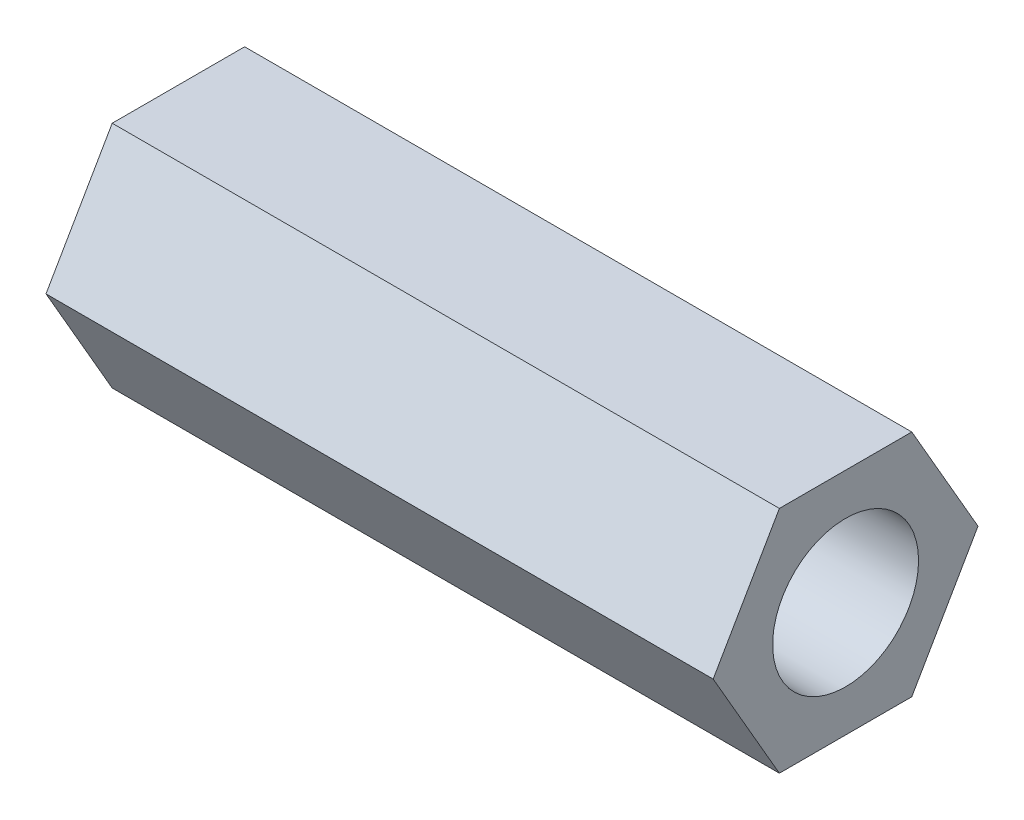
ISO-10303-21;
HEADER;
FILE_DESCRIPTION(('STEP AP214'),'2;1');
FILE_NAME('part.step','',(''),(''),'','','');
FILE_SCHEMA(('AUTOMOTIVE_DESIGN { 1 0 10303 214 1 1 1 1 }'));
ENDSEC;
DATA;
#1=APPLICATION_CONTEXT('core data for automotive mechanical design processes');
#2=APPLICATION_PROTOCOL_DEFINITION('international standard','automotive_design',2000,#1);
#3=PRODUCT_CONTEXT('',#1,'mechanical');
#4=PRODUCT('Part','Part','',(#3));
#5=PRODUCT_RELATED_PRODUCT_CATEGORY('part','',(#4));
#6=PRODUCT_DEFINITION_FORMATION('','',#4);
#7=PRODUCT_DEFINITION_CONTEXT('part definition',#1,'design');
#8=PRODUCT_DEFINITION('design','',#6,#7);
#9=PRODUCT_DEFINITION_SHAPE('','',#8);
#10=(LENGTH_UNIT() NAMED_UNIT(*) SI_UNIT(.MILLI.,.METRE.));
#11=(NAMED_UNIT(*) PLANE_ANGLE_UNIT() SI_UNIT($,.RADIAN.));
#12=(NAMED_UNIT(*) SI_UNIT($,.STERADIAN.) SOLID_ANGLE_UNIT());
#13=UNCERTAINTY_MEASURE_WITH_UNIT(LENGTH_MEASURE(1.E-05),#10,'distance_accuracy_value','');
#14=(GEOMETRIC_REPRESENTATION_CONTEXT(3) GLOBAL_UNCERTAINTY_ASSIGNED_CONTEXT((#13)) GLOBAL_UNIT_ASSIGNED_CONTEXT((#10,
#11,#12)) REPRESENTATION_CONTEXT('',''));
#15=CARTESIAN_POINT('',(0.,0.,0.));
#16=DIRECTION('',(0.,0.,1.));
#17=DIRECTION('',(1.,0.,0.));
#18=AXIS2_PLACEMENT_3D('',#15,#16,#17);
#19=CARTESIAN_POINT('',(50.8,0.,0.));
#20=DIRECTION('',(1.,0.,0.));
#21=DIRECTION('',(0.,0.,-1.));
#22=AXIS2_PLACEMENT_3D('',#19,#20,#21);
#23=PLANE('',#22);
#24=DIRECTION('',(0.,-0.866025403784439,0.5));
#25=VECTOR('',#24,1.);
#26=CARTESIAN_POINT('',(50.8,8.73125,5.04098953786192));
#27=LINE('',#26,#25);
#28=CARTESIAN_POINT('',(50.8,8.73125,5.04098953786192));
#29=VERTEX_POINT('',#28);
#30=CARTESIAN_POINT('',(50.8,0.,10.0819790757238));
#31=VERTEX_POINT('',#30);
#32=EDGE_CURVE('E146',#29,#31,#27,.T.);
#33=ORIENTED_EDGE('',*,*,#32,.T.);
#34=DIRECTION('',(0.,-0.866025403784438,-0.5));
#35=VECTOR('',#34,1.);
#36=CARTESIAN_POINT('',(50.8,0.,10.0819790757238));
#37=LINE('',#36,#35);
#38=CARTESIAN_POINT('',(50.8,-8.73125,5.04098953786192));
#39=VERTEX_POINT('',#38);
#40=EDGE_CURVE('E94',#31,#39,#37,.T.);
#41=ORIENTED_EDGE('',*,*,#40,.T.);
#42=DIRECTION('',(0.,0.,-1.));
#43=VECTOR('',#42,1.);
#44=CARTESIAN_POINT('',(50.8,-8.73125,5.04098953786192));
#45=LINE('',#44,#43);
#46=CARTESIAN_POINT('',(50.8,-8.73125,-5.04098953786192));
#47=VERTEX_POINT('',#46);
#48=EDGE_CURVE('E107',#39,#47,#45,.T.);
#49=ORIENTED_EDGE('',*,*,#48,.T.);
#50=DIRECTION('',(0.,0.866025403784439,-0.5));
#51=VECTOR('',#50,1.);
#52=CARTESIAN_POINT('',(50.8,-8.73125,-5.04098953786192));
#53=LINE('',#52,#51);
#54=CARTESIAN_POINT('',(50.8,0.,-10.0819790757238));
#55=VERTEX_POINT('',#54);
#56=EDGE_CURVE('E101',#47,#55,#53,.T.);
#57=ORIENTED_EDGE('',*,*,#56,.T.);
#58=DIRECTION('',(0.,0.866025403784439,0.5));
#59=VECTOR('',#58,1.);
#60=CARTESIAN_POINT('',(50.8,0.,-10.0819790757238));
#61=LINE('',#60,#59);
#62=CARTESIAN_POINT('',(50.8,8.73125,-5.04098953786191));
#63=VERTEX_POINT('',#62);
#64=EDGE_CURVE('E105',#55,#63,#61,.T.);
#65=ORIENTED_EDGE('',*,*,#64,.T.);
#66=DIRECTION('',(0.,0.,1.));
#67=VECTOR('',#66,1.);
#68=CARTESIAN_POINT('',(50.8,8.73125,-5.04098953786191));
#69=LINE('',#68,#67);
#70=EDGE_CURVE('E57',#63,#29,#69,.T.);
#71=ORIENTED_EDGE('',*,*,#70,.T.);
#72=EDGE_LOOP('',(#33,#41,#49,#57,#65,#71));
#73=FACE_BOUND('',#72,.T.);
#74=CARTESIAN_POINT('',(50.8,0.,0.));
#75=DIRECTION('',(1.,0.,0.));
#76=DIRECTION('',(0.,0.,-1.));
#77=AXIS2_PLACEMENT_3D('',#74,#75,#76);
#78=CIRCLE('',#77,5.55625);
#79=CARTESIAN_POINT('',(50.8,0.,-5.55625));
#80=VERTEX_POINT('',#79);
#81=EDGE_CURVE('E134',#80,#80,#78,.T.);
#82=ORIENTED_EDGE('',*,*,#81,.F.);
#83=EDGE_LOOP('',(#82));
#84=FACE_BOUND('',#83,.T.);
#85=ADVANCED_FACE('F39',(#73,#84),#23,.T.);
#86=CARTESIAN_POINT('',(0.,0.,0.));
#87=DIRECTION('',(1.,0.,0.));
#88=DIRECTION('',(0.,0.,-1.));
#89=AXIS2_PLACEMENT_3D('',#86,#87,#88);
#90=PLANE('',#89);
#91=DIRECTION('',(0.,-0.866025403784439,0.5));
#92=VECTOR('',#91,1.);
#93=CARTESIAN_POINT('',(0.,8.73125,5.04098953786192));
#94=LINE('',#93,#92);
#95=CARTESIAN_POINT('',(0.,8.73125,5.04098953786192));
#96=VERTEX_POINT('',#95);
#97=CARTESIAN_POINT('',(0.,0.,10.0819790757238));
#98=VERTEX_POINT('',#97);
#99=EDGE_CURVE('E129',#96,#98,#94,.T.);
#100=ORIENTED_EDGE('',*,*,#99,.F.);
#101=DIRECTION('',(0.,0.,1.));
#102=VECTOR('',#101,1.);
#103=CARTESIAN_POINT('',(0.,8.73125,-5.04098953786191));
#104=LINE('',#103,#102);
#105=CARTESIAN_POINT('',(0.,8.73125,-5.04098953786191));
#106=VERTEX_POINT('',#105);
#107=EDGE_CURVE('E86',#106,#96,#104,.T.);
#108=ORIENTED_EDGE('',*,*,#107,.F.);
#109=DIRECTION('',(0.,0.866025403784439,0.5));
#110=VECTOR('',#109,1.);
#111=CARTESIAN_POINT('',(0.,0.,-10.0819790757238));
#112=LINE('',#111,#110);
#113=CARTESIAN_POINT('',(0.,0.,-10.0819790757238));
#114=VERTEX_POINT('',#113);
#115=EDGE_CURVE('E80',#114,#106,#112,.T.);
#116=ORIENTED_EDGE('',*,*,#115,.F.);
#117=DIRECTION('',(0.,0.866025403784439,-0.5));
#118=VECTOR('',#117,1.);
#119=CARTESIAN_POINT('',(0.,-8.73125,-5.04098953786192));
#120=LINE('',#119,#118);
#121=CARTESIAN_POINT('',(0.,-8.73125,-5.04098953786192));
#122=VERTEX_POINT('',#121);
#123=EDGE_CURVE('E116',#122,#114,#120,.T.);
#124=ORIENTED_EDGE('',*,*,#123,.F.);
#125=DIRECTION('',(0.,0.,-1.));
#126=VECTOR('',#125,1.);
#127=CARTESIAN_POINT('',(0.,-8.73125,5.04098953786192));
#128=LINE('',#127,#126);
#129=CARTESIAN_POINT('',(0.,-8.73125,5.04098953786192));
#130=VERTEX_POINT('',#129);
#131=EDGE_CURVE('E137',#130,#122,#128,.T.);
#132=ORIENTED_EDGE('',*,*,#131,.F.);
#133=DIRECTION('',(0.,-0.866025403784438,-0.5));
#134=VECTOR('',#133,1.);
#135=CARTESIAN_POINT('',(0.,0.,10.0819790757238));
#136=LINE('',#135,#134);
#137=EDGE_CURVE('E133',#98,#130,#136,.T.);
#138=ORIENTED_EDGE('',*,*,#137,.F.);
#139=EDGE_LOOP('',(#100,#108,#116,#124,#132,#138));
#140=FACE_BOUND('',#139,.T.);
#141=CARTESIAN_POINT('',(0.,0.,0.));
#142=DIRECTION('',(1.,0.,0.));
#143=DIRECTION('',(0.,0.,-1.));
#144=AXIS2_PLACEMENT_3D('',#141,#142,#143);
#145=CIRCLE('',#144,5.55625);
#146=CARTESIAN_POINT('',(0.,0.,-5.55625));
#147=VERTEX_POINT('',#146);
#148=EDGE_CURVE('E243',#147,#147,#145,.T.);
#149=ORIENTED_EDGE('',*,*,#148,.T.);
#150=EDGE_LOOP('',(#149));
#151=FACE_BOUND('',#150,.T.);
#152=ADVANCED_FACE('F159',(#140,#151),#90,.F.);
#153=CARTESIAN_POINT('',(50.8,8.73125,5.04098953786192));
#154=DIRECTION('',(0.,-0.5,-0.866025403784439));
#155=DIRECTION('',(0.,0.866025403784439,-0.5));
#156=AXIS2_PLACEMENT_3D('',#153,#154,#155);
#157=PLANE('',#156);
#158=ORIENTED_EDGE('',*,*,#99,.T.);
#159=DIRECTION('',(-1.,0.,0.));
#160=VECTOR('',#159,1.);
#161=CARTESIAN_POINT('',(50.8,0.,10.0819790757238));
#162=LINE('',#161,#160);
#163=EDGE_CURVE('E11',#31,#98,#162,.T.);
#164=ORIENTED_EDGE('',*,*,#163,.F.);
#165=ORIENTED_EDGE('',*,*,#32,.F.);
#166=DIRECTION('',(-1.,0.,0.));
#167=VECTOR('',#166,1.);
#168=CARTESIAN_POINT('',(50.8,8.73125,5.04098953786192));
#169=LINE('',#168,#167);
#170=EDGE_CURVE('E125',#29,#96,#169,.T.);
#171=ORIENTED_EDGE('',*,*,#170,.T.);
#172=EDGE_LOOP('',(#158,#164,#165,#171));
#173=FACE_BOUND('',#172,.T.);
#174=ADVANCED_FACE('F41',(#173),#157,.F.);
#175=CARTESIAN_POINT('',(50.8,0.,10.0819790757238));
#176=DIRECTION('',(0.,0.5,-0.866025403784438));
#177=DIRECTION('',(0.,0.866025403784439,0.5));
#178=AXIS2_PLACEMENT_3D('',#175,#176,#177);
#179=PLANE('',#178);
#180=ORIENTED_EDGE('',*,*,#137,.T.);
#181=DIRECTION('',(-1.,0.,0.));
#182=VECTOR('',#181,1.);
#183=CARTESIAN_POINT('',(50.8,-8.73125,5.04098953786192));
#184=LINE('',#183,#182);
#185=EDGE_CURVE('E49',#39,#130,#184,.T.);
#186=ORIENTED_EDGE('',*,*,#185,.F.);
#187=ORIENTED_EDGE('',*,*,#40,.F.);
#188=ORIENTED_EDGE('',*,*,#163,.T.);
#189=EDGE_LOOP('',(#180,#186,#187,#188));
#190=FACE_BOUND('',#189,.T.);
#191=ADVANCED_FACE('F184',(#190),#179,.F.);
#192=CARTESIAN_POINT('',(50.8,-8.73125,5.04098953786192));
#193=DIRECTION('',(0.,1.,0.));
#194=DIRECTION('',(0.,0.,1.));
#195=AXIS2_PLACEMENT_3D('',#192,#193,#194);
#196=PLANE('',#195);
#197=ORIENTED_EDGE('',*,*,#131,.T.);
#198=DIRECTION('',(-1.,0.,0.));
#199=VECTOR('',#198,1.);
#200=CARTESIAN_POINT('',(50.8,-8.73125,-5.04098953786192));
#201=LINE('',#200,#199);
#202=EDGE_CURVE('E118',#47,#122,#201,.T.);
#203=ORIENTED_EDGE('',*,*,#202,.F.);
#204=ORIENTED_EDGE('',*,*,#48,.F.);
#205=ORIENTED_EDGE('',*,*,#185,.T.);
#206=EDGE_LOOP('',(#197,#203,#204,#205));
#207=FACE_BOUND('',#206,.T.);
#208=ADVANCED_FACE('F156',(#207),#196,.F.);
#209=CARTESIAN_POINT('',(50.8,-8.73125,-5.04098953786192));
#210=DIRECTION('',(0.,0.5,0.866025403784439));
#211=DIRECTION('',(0.,-0.866025403784439,0.5));
#212=AXIS2_PLACEMENT_3D('',#209,#210,#211);
#213=PLANE('',#212);
#214=ORIENTED_EDGE('',*,*,#123,.T.);
#215=DIRECTION('',(-1.,0.,0.));
#216=VECTOR('',#215,1.);
#217=CARTESIAN_POINT('',(50.8,0.,-10.0819790757238));
#218=LINE('',#217,#216);
#219=EDGE_CURVE('E113',#55,#114,#218,.T.);
#220=ORIENTED_EDGE('',*,*,#219,.F.);
#221=ORIENTED_EDGE('',*,*,#56,.F.);
#222=ORIENTED_EDGE('',*,*,#202,.T.);
#223=EDGE_LOOP('',(#214,#220,#221,#222));
#224=FACE_BOUND('',#223,.T.);
#225=ADVANCED_FACE('F114',(#224),#213,.F.);
#226=CARTESIAN_POINT('',(50.8,0.,-10.0819790757238));
#227=DIRECTION('',(0.,-0.5,0.866025403784438));
#228=DIRECTION('',(0.,-0.866025403784439,-0.5));
#229=AXIS2_PLACEMENT_3D('',#226,#227,#228);
#230=PLANE('',#229);
#231=ORIENTED_EDGE('',*,*,#115,.T.);
#232=DIRECTION('',(-1.,0.,0.));
#233=VECTOR('',#232,1.);
#234=CARTESIAN_POINT('',(50.8,8.73125,-5.04098953786191));
#235=LINE('',#234,#233);
#236=EDGE_CURVE('E119',#63,#106,#235,.T.);
#237=ORIENTED_EDGE('',*,*,#236,.F.);
#238=ORIENTED_EDGE('',*,*,#64,.F.);
#239=ORIENTED_EDGE('',*,*,#219,.T.);
#240=EDGE_LOOP('',(#231,#237,#238,#239));
#241=FACE_BOUND('',#240,.T.);
#242=ADVANCED_FACE('F121',(#241),#230,.F.);
#243=CARTESIAN_POINT('',(50.8,8.73125,-5.04098953786191));
#244=DIRECTION('',(0.,-1.,0.));
#245=DIRECTION('',(0.,0.,-1.));
#246=AXIS2_PLACEMENT_3D('',#243,#244,#245);
#247=PLANE('',#246);
#248=ORIENTED_EDGE('',*,*,#107,.T.);
#249=ORIENTED_EDGE('',*,*,#170,.F.);
#250=ORIENTED_EDGE('',*,*,#70,.F.);
#251=ORIENTED_EDGE('',*,*,#236,.T.);
#252=EDGE_LOOP('',(#248,#249,#250,#251));
#253=FACE_BOUND('',#252,.T.);
#254=ADVANCED_FACE('F164',(#253),#247,.F.);
#255=CARTESIAN_POINT('',(50.8,0.,0.));
#256=DIRECTION('',(-1.,0.,0.));
#257=DIRECTION('',(0.,0.,1.));
#258=AXIS2_PLACEMENT_3D('',#255,#256,#257);
#259=CYLINDRICAL_SURFACE('',#258,5.55625);
#260=ORIENTED_EDGE('',*,*,#81,.T.);
#261=EDGE_LOOP('',(#260));
#262=FACE_BOUND('',#261,.T.);
#263=ORIENTED_EDGE('',*,*,#148,.F.);
#264=EDGE_LOOP('',(#263));
#265=FACE_BOUND('',#264,.T.);
#266=ADVANCED_FACE('F166',(#262,#265),#259,.F.);
#267=CLOSED_SHELL('',(#85,#152,#174,#191,#208,#225,#242,#254,#266));
#268=MANIFOLD_SOLID_BREP('B2',#267);
#269=ADVANCED_BREP_SHAPE_REPRESENTATION('',(#18,#268),#14);
#270=SHAPE_DEFINITION_REPRESENTATION(#9,#269);
ENDSEC;
END-ISO-10303-21;
